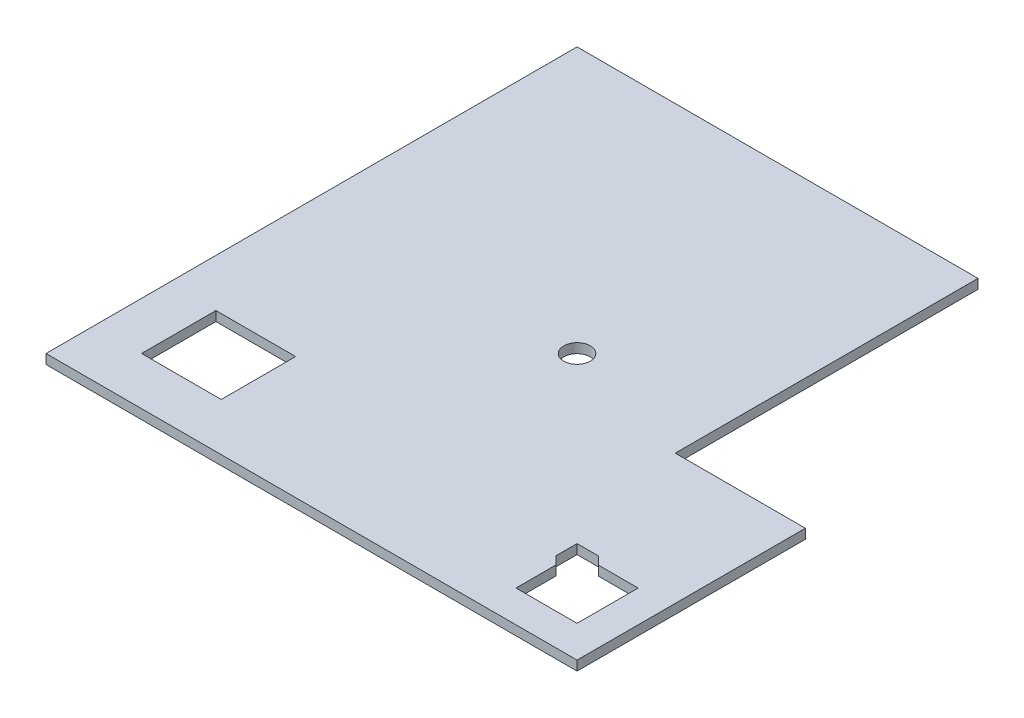
ISO-10303-21;
HEADER;
FILE_DESCRIPTION(('STEP AP214'),'2;1');
FILE_NAME('part.step','',(''),(''),'','','');
FILE_SCHEMA(('AUTOMOTIVE_DESIGN { 1 0 10303 214 1 1 1 1 }'));
ENDSEC;
DATA;
#1=APPLICATION_CONTEXT('core data for automotive mechanical design processes');
#2=APPLICATION_PROTOCOL_DEFINITION('international standard','automotive_design',2000,#1);
#3=PRODUCT_CONTEXT('',#1,'mechanical');
#4=PRODUCT('Part','Part','',(#3));
#5=PRODUCT_RELATED_PRODUCT_CATEGORY('part','',(#4));
#6=PRODUCT_DEFINITION_FORMATION('','',#4);
#7=PRODUCT_DEFINITION_CONTEXT('part definition',#1,'design');
#8=PRODUCT_DEFINITION('design','',#6,#7);
#9=PRODUCT_DEFINITION_SHAPE('','',#8);
#10=(LENGTH_UNIT() NAMED_UNIT(*) SI_UNIT(.MILLI.,.METRE.));
#11=(NAMED_UNIT(*) PLANE_ANGLE_UNIT() SI_UNIT($,.RADIAN.));
#12=(NAMED_UNIT(*) SI_UNIT($,.STERADIAN.) SOLID_ANGLE_UNIT());
#13=UNCERTAINTY_MEASURE_WITH_UNIT(LENGTH_MEASURE(1.E-05),#10,'distance_accuracy_value','');
#14=(GEOMETRIC_REPRESENTATION_CONTEXT(3) GLOBAL_UNCERTAINTY_ASSIGNED_CONTEXT((#13)) GLOBAL_UNIT_ASSIGNED_CONTEXT((#10,
#11,#12)) REPRESENTATION_CONTEXT('',''));
#15=CARTESIAN_POINT('',(0.,0.,0.));
#16=DIRECTION('',(0.,0.,1.));
#17=DIRECTION('',(1.,0.,0.));
#18=AXIS2_PLACEMENT_3D('',#15,#16,#17);
#19=CARTESIAN_POINT('',(0.,18.,-1000.));
#20=DIRECTION('',(1.,0.,0.));
#21=DIRECTION('',(0.,0.,-1.));
#22=AXIS2_PLACEMENT_3D('',#19,#20,#21);
#23=PLANE('',#22);
#24=DIRECTION('',(0.,0.,1.));
#25=VECTOR('',#24,1.);
#26=CARTESIAN_POINT('',(0.,0.,-1000.));
#27=LINE('',#26,#25);
#28=CARTESIAN_POINT('',(0.,0.,-1000.));
#29=VERTEX_POINT('',#28);
#30=CARTESIAN_POINT('',(0.,0.,0.));
#31=VERTEX_POINT('',#30);
#32=EDGE_CURVE('E240',#29,#31,#27,.T.);
#33=ORIENTED_EDGE('',*,*,#32,.T.);
#34=DIRECTION('',(0.,-1.,0.));
#35=VECTOR('',#34,1.);
#36=CARTESIAN_POINT('',(0.,18.,0.));
#37=LINE('',#36,#35);
#38=CARTESIAN_POINT('',(0.,18.,0.));
#39=VERTEX_POINT('',#38);
#40=EDGE_CURVE('E11',#39,#31,#37,.T.);
#41=ORIENTED_EDGE('',*,*,#40,.F.);
#42=DIRECTION('',(0.,0.,1.));
#43=VECTOR('',#42,1.);
#44=CARTESIAN_POINT('',(0.,18.,-1000.));
#45=LINE('',#44,#43);
#46=CARTESIAN_POINT('',(0.,18.,-1000.));
#47=VERTEX_POINT('',#46);
#48=EDGE_CURVE('E241',#47,#39,#45,.T.);
#49=ORIENTED_EDGE('',*,*,#48,.F.);
#50=DIRECTION('',(0.,-1.,0.));
#51=VECTOR('',#50,1.);
#52=CARTESIAN_POINT('',(0.,18.,-1000.));
#53=LINE('',#52,#51);
#54=EDGE_CURVE('E255',#47,#29,#53,.T.);
#55=ORIENTED_EDGE('',*,*,#54,.T.);
#56=EDGE_LOOP('',(#33,#41,#49,#55));
#57=FACE_BOUND('',#56,.T.);
#58=ADVANCED_FACE('F35',(#57),#23,.F.);
#59=CARTESIAN_POINT('',(0.,18.,0.));
#60=DIRECTION('',(0.,0.,-1.));
#61=DIRECTION('',(-1.,0.,0.));
#62=AXIS2_PLACEMENT_3D('',#59,#60,#61);
#63=PLANE('',#62);
#64=DIRECTION('',(1.,0.,0.));
#65=VECTOR('',#64,1.);
#66=CARTESIAN_POINT('',(0.,0.,0.));
#67=LINE('',#66,#65);
#68=CARTESIAN_POINT('',(1000.,0.,-3.85887537858734E-12));
#69=VERTEX_POINT('',#68);
#70=EDGE_CURVE('E258',#31,#69,#67,.T.);
#71=ORIENTED_EDGE('',*,*,#70,.T.);
#72=DIRECTION('',(0.,-1.,0.));
#73=VECTOR('',#72,1.);
#74=CARTESIAN_POINT('',(1000.,18.,-3.85887537858734E-12));
#75=LINE('',#74,#73);
#76=CARTESIAN_POINT('',(1000.,18.,-3.85887537858734E-12));
#77=VERTEX_POINT('',#76);
#78=EDGE_CURVE('E42',#77,#69,#75,.T.);
#79=ORIENTED_EDGE('',*,*,#78,.F.);
#80=DIRECTION('',(1.,0.,0.));
#81=VECTOR('',#80,1.);
#82=CARTESIAN_POINT('',(0.,18.,0.));
#83=LINE('',#82,#81);
#84=EDGE_CURVE('E244',#39,#77,#83,.T.);
#85=ORIENTED_EDGE('',*,*,#84,.F.);
#86=ORIENTED_EDGE('',*,*,#40,.T.);
#87=EDGE_LOOP('',(#71,#79,#85,#86));
#88=FACE_BOUND('',#87,.T.);
#89=ADVANCED_FACE('F304',(#88),#63,.F.);
#90=CARTESIAN_POINT('',(1000.,18.,-3.85887537858734E-12));
#91=DIRECTION('',(-1.,0.,0.));
#92=DIRECTION('',(0.,0.,1.));
#93=AXIS2_PLACEMENT_3D('',#90,#91,#92);
#94=PLANE('',#93);
#95=DIRECTION('',(0.,0.,-1.));
#96=VECTOR('',#95,1.);
#97=CARTESIAN_POINT('',(1000.,0.,-3.85887537858734E-12));
#98=LINE('',#97,#96);
#99=CARTESIAN_POINT('',(1000.,0.,-430.000000000001));
#100=VERTEX_POINT('',#99);
#101=EDGE_CURVE('E260',#69,#100,#98,.T.);
#102=ORIENTED_EDGE('',*,*,#101,.T.);
#103=DIRECTION('',(0.,-1.,0.));
#104=VECTOR('',#103,1.);
#105=CARTESIAN_POINT('',(1000.,18.,-430.000000000001));
#106=LINE('',#105,#104);
#107=CARTESIAN_POINT('',(1000.,18.,-430.000000000001));
#108=VERTEX_POINT('',#107);
#109=EDGE_CURVE('E275',#108,#100,#106,.T.);
#110=ORIENTED_EDGE('',*,*,#109,.F.);
#111=DIRECTION('',(0.,0.,-1.));
#112=VECTOR('',#111,1.);
#113=CARTESIAN_POINT('',(1000.,18.,-3.85887537858734E-12));
#114=LINE('',#113,#112);
#115=EDGE_CURVE('E247',#77,#108,#114,.T.);
#116=ORIENTED_EDGE('',*,*,#115,.F.);
#117=ORIENTED_EDGE('',*,*,#78,.T.);
#118=EDGE_LOOP('',(#102,#110,#116,#117));
#119=FACE_BOUND('',#118,.T.);
#120=ADVANCED_FACE('F282',(#119),#94,.F.);
#121=CARTESIAN_POINT('',(1000.,18.,-430.000000000001));
#122=DIRECTION('',(0.,0.,1.));
#123=DIRECTION('',(1.,0.,0.));
#124=AXIS2_PLACEMENT_3D('',#121,#122,#123);
#125=PLANE('',#124);
#126=DIRECTION('',(-1.,0.,0.));
#127=VECTOR('',#126,1.);
#128=CARTESIAN_POINT('',(1000.,0.,-430.000000000001));
#129=LINE('',#128,#127);
#130=CARTESIAN_POINT('',(755.,0.,-430.));
#131=VERTEX_POINT('',#130);
#132=EDGE_CURVE('E262',#100,#131,#129,.T.);
#133=ORIENTED_EDGE('',*,*,#132,.T.);
#134=DIRECTION('',(0.,-1.,0.));
#135=VECTOR('',#134,1.);
#136=CARTESIAN_POINT('',(755.,18.,-430.));
#137=LINE('',#136,#135);
#138=CARTESIAN_POINT('',(755.,18.,-430.));
#139=VERTEX_POINT('',#138);
#140=EDGE_CURVE('E272',#139,#131,#137,.T.);
#141=ORIENTED_EDGE('',*,*,#140,.F.);
#142=DIRECTION('',(-1.,0.,0.));
#143=VECTOR('',#142,1.);
#144=CARTESIAN_POINT('',(1000.,18.,-430.000000000001));
#145=LINE('',#144,#143);
#146=EDGE_CURVE('E249',#108,#139,#145,.T.);
#147=ORIENTED_EDGE('',*,*,#146,.F.);
#148=ORIENTED_EDGE('',*,*,#109,.T.);
#149=EDGE_LOOP('',(#133,#141,#147,#148));
#150=FACE_BOUND('',#149,.T.);
#151=ADVANCED_FACE('F293',(#150),#125,.F.);
#152=CARTESIAN_POINT('',(755.,18.,-430.));
#153=DIRECTION('',(-1.,0.,0.));
#154=DIRECTION('',(0.,0.,1.));
#155=AXIS2_PLACEMENT_3D('',#152,#153,#154);
#156=PLANE('',#155);
#157=DIRECTION('',(0.,0.,-1.));
#158=VECTOR('',#157,1.);
#159=CARTESIAN_POINT('',(755.,0.,-430.));
#160=LINE('',#159,#158);
#161=CARTESIAN_POINT('',(755.,0.,-1000.));
#162=VERTEX_POINT('',#161);
#163=EDGE_CURVE('E264',#131,#162,#160,.T.);
#164=ORIENTED_EDGE('',*,*,#163,.T.);
#165=DIRECTION('',(0.,-1.,0.));
#166=VECTOR('',#165,1.);
#167=CARTESIAN_POINT('',(755.,18.,-1000.));
#168=LINE('',#167,#166);
#169=CARTESIAN_POINT('',(755.,18.,-1000.));
#170=VERTEX_POINT('',#169);
#171=EDGE_CURVE('E269',#170,#162,#168,.T.);
#172=ORIENTED_EDGE('',*,*,#171,.F.);
#173=DIRECTION('',(0.,0.,-1.));
#174=VECTOR('',#173,1.);
#175=CARTESIAN_POINT('',(755.,18.,-430.));
#176=LINE('',#175,#174);
#177=EDGE_CURVE('E251',#139,#170,#176,.T.);
#178=ORIENTED_EDGE('',*,*,#177,.F.);
#179=ORIENTED_EDGE('',*,*,#140,.T.);
#180=EDGE_LOOP('',(#164,#172,#178,#179));
#181=FACE_BOUND('',#180,.T.);
#182=ADVANCED_FACE('F297',(#181),#156,.F.);
#183=CARTESIAN_POINT('',(755.,18.,-1000.));
#184=DIRECTION('',(0.,0.,1.));
#185=DIRECTION('',(1.,0.,0.));
#186=AXIS2_PLACEMENT_3D('',#183,#184,#185);
#187=PLANE('',#186);
#188=DIRECTION('',(-1.,0.,0.));
#189=VECTOR('',#188,1.);
#190=CARTESIAN_POINT('',(755.,0.,-1000.));
#191=LINE('',#190,#189);
#192=EDGE_CURVE('E245',#162,#29,#191,.T.);
#193=ORIENTED_EDGE('',*,*,#192,.T.);
#194=ORIENTED_EDGE('',*,*,#54,.F.);
#195=DIRECTION('',(-1.,0.,0.));
#196=VECTOR('',#195,1.);
#197=CARTESIAN_POINT('',(755.,18.,-1000.));
#198=LINE('',#197,#196);
#199=EDGE_CURVE('E253',#170,#47,#198,.T.);
#200=ORIENTED_EDGE('',*,*,#199,.F.);
#201=ORIENTED_EDGE('',*,*,#171,.T.);
#202=EDGE_LOOP('',(#193,#194,#200,#201));
#203=FACE_BOUND('',#202,.T.);
#204=ADVANCED_FACE('F307',(#203),#187,.F.);
#205=CARTESIAN_POINT('',(0.,18.,0.));
#206=DIRECTION('',(0.,1.,0.));
#207=DIRECTION('',(0.,0.,1.));
#208=AXIS2_PLACEMENT_3D('',#205,#206,#207);
#209=PLANE('',#208);
#210=CARTESIAN_POINT('',(500.,18.,-500.));
#211=DIRECTION('',(0.,1.,0.));
#212=DIRECTION('',(0.,0.,1.));
#213=AXIS2_PLACEMENT_3D('',#210,#211,#212);
#214=CIRCLE('',#213,25.);
#215=CARTESIAN_POINT('',(500.,18.,-475.));
#216=VERTEX_POINT('',#215);
#217=EDGE_CURVE('E487',#216,#216,#214,.T.);
#218=ORIENTED_EDGE('',*,*,#217,.F.);
#219=EDGE_LOOP('',(#218));
#220=FACE_BOUND('',#219,.T.);
#221=DIRECTION('',(1.,0.,0.));
#222=VECTOR('',#221,1.);
#223=CARTESIAN_POINT('',(940.,18.,-60.));
#224=LINE('',#223,#222);
#225=CARTESIAN_POINT('',(825.,18.,-60.));
#226=VERTEX_POINT('',#225);
#227=CARTESIAN_POINT('',(940.,18.,-60.));
#228=VERTEX_POINT('',#227);
#229=EDGE_CURVE('E49',#226,#228,#224,.T.);
#230=ORIENTED_EDGE('',*,*,#229,.F.);
#231=DIRECTION('',(0.,0.,1.));
#232=VECTOR('',#231,1.);
#233=CARTESIAN_POINT('',(825.,18.,-60.));
#234=LINE('',#233,#232);
#235=CARTESIAN_POINT('',(825.,18.,-134.999999999998));
#236=VERTEX_POINT('',#235);
#237=EDGE_CURVE('E193',#236,#226,#234,.T.);
#238=ORIENTED_EDGE('',*,*,#237,.F.);
#239=DIRECTION('',(0.70710678118657,0.,0.707106781186525));
#240=VECTOR('',#239,1.);
#241=CARTESIAN_POINT('',(825.,18.,-134.999999999998));
#242=LINE('',#241,#240);
#243=CARTESIAN_POINT('',(809.999999999997,18.,-150.));
#244=VERTEX_POINT('',#243);
#245=EDGE_CURVE('E190',#244,#236,#242,.T.);
#246=ORIENTED_EDGE('',*,*,#245,.F.);
#247=DIRECTION('',(0.,0.,1.));
#248=VECTOR('',#247,1.);
#249=CARTESIAN_POINT('',(809.999999999997,18.,-150.));
#250=LINE('',#249,#248);
#251=CARTESIAN_POINT('',(809.999999999998,18.,-189.999999999999));
#252=VERTEX_POINT('',#251);
#253=EDGE_CURVE('E187',#252,#244,#250,.T.);
#254=ORIENTED_EDGE('',*,*,#253,.F.);
#255=DIRECTION('',(-1.,0.,0.));
#256=VECTOR('',#255,1.);
#257=CARTESIAN_POINT('',(849.999999999998,18.,-189.999999999998));
#258=LINE('',#257,#256);
#259=CARTESIAN_POINT('',(849.999999999998,18.,-189.999999999998));
#260=VERTEX_POINT('',#259);
#261=EDGE_CURVE('E181',#260,#252,#258,.T.);
#262=ORIENTED_EDGE('',*,*,#261,.F.);
#263=DIRECTION('',(-0.707106781186646,0.,-0.707106781186449));
#264=VECTOR('',#263,1.);
#265=CARTESIAN_POINT('',(849.999999999998,18.,-189.999999999998));
#266=LINE('',#265,#264);
#267=CARTESIAN_POINT('',(865.,18.,-175.));
#268=VERTEX_POINT('',#267);
#269=EDGE_CURVE('E179',#268,#260,#266,.T.);
#270=ORIENTED_EDGE('',*,*,#269,.F.);
#271=DIRECTION('',(-1.,0.,0.));
#272=VECTOR('',#271,1.);
#273=CARTESIAN_POINT('',(865.,18.,-175.));
#274=LINE('',#273,#272);
#275=CARTESIAN_POINT('',(940.,18.,-175.));
#276=VERTEX_POINT('',#275);
#277=EDGE_CURVE('E162',#276,#268,#274,.T.);
#278=ORIENTED_EDGE('',*,*,#277,.F.);
#279=DIRECTION('',(0.,0.,-1.));
#280=VECTOR('',#279,1.);
#281=CARTESIAN_POINT('',(940.,18.,-60.));
#282=LINE('',#281,#280);
#283=EDGE_CURVE('E171',#228,#276,#282,.T.);
#284=ORIENTED_EDGE('',*,*,#283,.F.);
#285=EDGE_LOOP('',(#230,#238,#246,#254,#262,#270,#278,#284));
#286=FACE_BOUND('',#285,.T.);
#287=DIRECTION('',(0.,0.,-1.));
#288=VECTOR('',#287,1.);
#289=CARTESIAN_POINT('',(239.999999999995,18.,-90.000000000002));
#290=LINE('',#289,#288);
#291=CARTESIAN_POINT('',(239.999999999995,18.,-90.000000000002));
#292=VERTEX_POINT('',#291);
#293=CARTESIAN_POINT('',(239.999999999995,18.,-230.000000000002));
#294=VERTEX_POINT('',#293);
#295=EDGE_CURVE('E210',#292,#294,#290,.T.);
#296=ORIENTED_EDGE('',*,*,#295,.F.);
#297=DIRECTION('',(1.,0.,0.));
#298=VECTOR('',#297,1.);
#299=CARTESIAN_POINT('',(239.999999999995,18.,-90.000000000002));
#300=LINE('',#299,#298);
#301=CARTESIAN_POINT('',(89.9999999999949,18.,-90.000000000002));
#302=VERTEX_POINT('',#301);
#303=EDGE_CURVE('E228',#302,#292,#300,.T.);
#304=ORIENTED_EDGE('',*,*,#303,.F.);
#305=DIRECTION('',(0.,0.,1.));
#306=VECTOR('',#305,1.);
#307=CARTESIAN_POINT('',(89.9999999999949,18.,-90.000000000002));
#308=LINE('',#307,#306);
#309=CARTESIAN_POINT('',(89.9999999999949,18.,-230.000000000002));
#310=VERTEX_POINT('',#309);
#311=EDGE_CURVE('E225',#310,#302,#308,.T.);
#312=ORIENTED_EDGE('',*,*,#311,.F.);
#313=DIRECTION('',(-1.,0.,0.));
#314=VECTOR('',#313,1.);
#315=CARTESIAN_POINT('',(239.999999999995,18.,-230.000000000002));
#316=LINE('',#315,#314);
#317=EDGE_CURVE('E222',#294,#310,#316,.T.);
#318=ORIENTED_EDGE('',*,*,#317,.F.);
#319=EDGE_LOOP('',(#296,#304,#312,#318));
#320=FACE_BOUND('',#319,.T.);
#321=ORIENTED_EDGE('',*,*,#48,.T.);
#322=ORIENTED_EDGE('',*,*,#84,.T.);
#323=ORIENTED_EDGE('',*,*,#115,.T.);
#324=ORIENTED_EDGE('',*,*,#146,.T.);
#325=ORIENTED_EDGE('',*,*,#177,.T.);
#326=ORIENTED_EDGE('',*,*,#199,.T.);
#327=EDGE_LOOP('',(#321,#322,#323,#324,#325,#326));
#328=FACE_BOUND('',#327,.T.);
#329=ADVANCED_FACE('F175',(#220,#286,#320,#328),#209,.T.);
#330=CARTESIAN_POINT('',(0.,0.,0.));
#331=DIRECTION('',(0.,1.,0.));
#332=DIRECTION('',(0.,0.,1.));
#333=AXIS2_PLACEMENT_3D('',#330,#331,#332);
#334=PLANE('',#333);
#335=CARTESIAN_POINT('',(500.,0.,-500.));
#336=DIRECTION('',(0.,1.,0.));
#337=DIRECTION('',(0.,0.,1.));
#338=AXIS2_PLACEMENT_3D('',#335,#336,#337);
#339=CIRCLE('',#338,25.);
#340=CARTESIAN_POINT('',(500.,0.,-475.));
#341=VERTEX_POINT('',#340);
#342=EDGE_CURVE('E484',#341,#341,#339,.T.);
#343=ORIENTED_EDGE('',*,*,#342,.T.);
#344=EDGE_LOOP('',(#343));
#345=FACE_BOUND('',#344,.T.);
#346=DIRECTION('',(0.,0.,-1.));
#347=VECTOR('',#346,1.);
#348=CARTESIAN_POINT('',(825.,0.,-60.));
#349=LINE('',#348,#347);
#350=CARTESIAN_POINT('',(825.,0.,-60.));
#351=VERTEX_POINT('',#350);
#352=CARTESIAN_POINT('',(825.,0.,-134.999999999998));
#353=VERTEX_POINT('',#352);
#354=EDGE_CURVE('E500',#351,#353,#349,.T.);
#355=ORIENTED_EDGE('',*,*,#354,.F.);
#356=DIRECTION('',(-1.,0.,0.));
#357=VECTOR('',#356,1.);
#358=CARTESIAN_POINT('',(940.,0.,-60.));
#359=LINE('',#358,#357);
#360=CARTESIAN_POINT('',(940.,0.,-60.));
#361=VERTEX_POINT('',#360);
#362=EDGE_CURVE('E211',#361,#351,#359,.T.);
#363=ORIENTED_EDGE('',*,*,#362,.F.);
#364=DIRECTION('',(0.,0.,1.));
#365=VECTOR('',#364,1.);
#366=CARTESIAN_POINT('',(940.,0.,-60.));
#367=LINE('',#366,#365);
#368=CARTESIAN_POINT('',(940.,0.,-175.));
#369=VERTEX_POINT('',#368);
#370=EDGE_CURVE('E208',#369,#361,#367,.T.);
#371=ORIENTED_EDGE('',*,*,#370,.F.);
#372=DIRECTION('',(1.,0.,0.));
#373=VECTOR('',#372,1.);
#374=CARTESIAN_POINT('',(865.,0.,-175.));
#375=LINE('',#374,#373);
#376=CARTESIAN_POINT('',(865.,0.,-175.));
#377=VERTEX_POINT('',#376);
#378=EDGE_CURVE('E165',#377,#369,#375,.T.);
#379=ORIENTED_EDGE('',*,*,#378,.F.);
#380=DIRECTION('',(0.707106781186646,0.,0.707106781186449));
#381=VECTOR('',#380,1.);
#382=CARTESIAN_POINT('',(849.999999999998,0.,-189.999999999998));
#383=LINE('',#382,#381);
#384=CARTESIAN_POINT('',(849.999999999998,0.,-189.999999999998));
#385=VERTEX_POINT('',#384);
#386=EDGE_CURVE('E492',#385,#377,#383,.T.);
#387=ORIENTED_EDGE('',*,*,#386,.F.);
#388=DIRECTION('',(1.,0.,0.));
#389=VECTOR('',#388,1.);
#390=CARTESIAN_POINT('',(849.999999999998,0.,-189.999999999998));
#391=LINE('',#390,#389);
#392=CARTESIAN_POINT('',(809.999999999998,0.,-189.999999999999));
#393=VERTEX_POINT('',#392);
#394=EDGE_CURVE('E494',#393,#385,#391,.T.);
#395=ORIENTED_EDGE('',*,*,#394,.F.);
#396=DIRECTION('',(0.,0.,-1.));
#397=VECTOR('',#396,1.);
#398=CARTESIAN_POINT('',(809.999999999997,0.,-150.));
#399=LINE('',#398,#397);
#400=CARTESIAN_POINT('',(809.999999999997,0.,-150.));
#401=VERTEX_POINT('',#400);
#402=EDGE_CURVE('E496',#401,#393,#399,.T.);
#403=ORIENTED_EDGE('',*,*,#402,.F.);
#404=DIRECTION('',(-0.707106781186571,0.,-0.707106781186525));
#405=VECTOR('',#404,1.);
#406=CARTESIAN_POINT('',(825.,0.,-134.999999999998));
#407=LINE('',#406,#405);
#408=EDGE_CURVE('E498',#353,#401,#407,.T.);
#409=ORIENTED_EDGE('',*,*,#408,.F.);
#410=EDGE_LOOP('',(#355,#363,#371,#379,#387,#395,#403,#409));
#411=FACE_BOUND('',#410,.T.);
#412=DIRECTION('',(-1.,0.,0.));
#413=VECTOR('',#412,1.);
#414=CARTESIAN_POINT('',(239.999999999995,0.,-90.000000000002));
#415=LINE('',#414,#413);
#416=CARTESIAN_POINT('',(239.999999999995,0.,-90.000000000002));
#417=VERTEX_POINT('',#416);
#418=CARTESIAN_POINT('',(89.9999999999949,0.,-90.000000000002));
#419=VERTEX_POINT('',#418);
#420=EDGE_CURVE('E215',#417,#419,#415,.T.);
#421=ORIENTED_EDGE('',*,*,#420,.F.);
#422=DIRECTION('',(0.,0.,1.));
#423=VECTOR('',#422,1.);
#424=CARTESIAN_POINT('',(239.999999999995,0.,-90.000000000002));
#425=LINE('',#424,#423);
#426=CARTESIAN_POINT('',(239.999999999995,0.,-230.000000000002));
#427=VERTEX_POINT('',#426);
#428=EDGE_CURVE('E218',#427,#417,#425,.T.);
#429=ORIENTED_EDGE('',*,*,#428,.F.);
#430=DIRECTION('',(1.,0.,0.));
#431=VECTOR('',#430,1.);
#432=CARTESIAN_POINT('',(239.999999999995,0.,-230.000000000002));
#433=LINE('',#432,#431);
#434=CARTESIAN_POINT('',(89.9999999999949,0.,-230.000000000002));
#435=VERTEX_POINT('',#434);
#436=EDGE_CURVE('E220',#435,#427,#433,.T.);
#437=ORIENTED_EDGE('',*,*,#436,.F.);
#438=DIRECTION('',(0.,0.,-1.));
#439=VECTOR('',#438,1.);
#440=CARTESIAN_POINT('',(89.9999999999949,0.,-90.000000000002));
#441=LINE('',#440,#439);
#442=EDGE_CURVE('E212',#419,#435,#441,.T.);
#443=ORIENTED_EDGE('',*,*,#442,.F.);
#444=EDGE_LOOP('',(#421,#429,#437,#443));
#445=FACE_BOUND('',#444,.T.);
#446=ORIENTED_EDGE('',*,*,#32,.F.);
#447=ORIENTED_EDGE('',*,*,#192,.F.);
#448=ORIENTED_EDGE('',*,*,#163,.F.);
#449=ORIENTED_EDGE('',*,*,#132,.F.);
#450=ORIENTED_EDGE('',*,*,#101,.F.);
#451=ORIENTED_EDGE('',*,*,#70,.F.);
#452=EDGE_LOOP('',(#446,#447,#448,#449,#450,#451));
#453=FACE_BOUND('',#452,.T.);
#454=ADVANCED_FACE('F288',(#345,#411,#445,#453),#334,.F.);
#455=CARTESIAN_POINT('',(239.999999999995,-205.182845286832,-90.000000000002));
#456=DIRECTION('',(1.,0.,0.));
#457=DIRECTION('',(0.,0.,-1.));
#458=AXIS2_PLACEMENT_3D('',#455,#456,#457);
#459=PLANE('',#458);
#460=ORIENTED_EDGE('',*,*,#428,.T.);
#461=DIRECTION('',(0.,1.,0.));
#462=VECTOR('',#461,1.);
#463=CARTESIAN_POINT('',(239.999999999995,-205.182845286832,-90.000000000002));
#464=LINE('',#463,#462);
#465=EDGE_CURVE('E216',#417,#292,#464,.T.);
#466=ORIENTED_EDGE('',*,*,#465,.T.);
#467=ORIENTED_EDGE('',*,*,#295,.T.);
#468=DIRECTION('',(0.,1.,0.));
#469=VECTOR('',#468,1.);
#470=CARTESIAN_POINT('',(239.999999999995,-205.182845286832,-230.000000000002));
#471=LINE('',#470,#469);
#472=EDGE_CURVE('E231',#427,#294,#471,.T.);
#473=ORIENTED_EDGE('',*,*,#472,.F.);
#474=EDGE_LOOP('',(#460,#466,#467,#473));
#475=FACE_BOUND('',#474,.T.);
#476=ADVANCED_FACE('F347',(#475),#459,.F.);
#477=CARTESIAN_POINT('',(239.999999999995,-205.182845286832,-90.000000000002));
#478=DIRECTION('',(0.,0.,1.));
#479=DIRECTION('',(1.,0.,0.));
#480=AXIS2_PLACEMENT_3D('',#477,#478,#479);
#481=PLANE('',#480);
#482=ORIENTED_EDGE('',*,*,#420,.T.);
#483=DIRECTION('',(0.,1.,0.));
#484=VECTOR('',#483,1.);
#485=CARTESIAN_POINT('',(89.9999999999949,-205.182845286832,-90.000000000002));
#486=LINE('',#485,#484);
#487=EDGE_CURVE('E233',#419,#302,#486,.T.);
#488=ORIENTED_EDGE('',*,*,#487,.T.);
#489=ORIENTED_EDGE('',*,*,#303,.T.);
#490=ORIENTED_EDGE('',*,*,#465,.F.);
#491=EDGE_LOOP('',(#482,#488,#489,#490));
#492=FACE_BOUND('',#491,.T.);
#493=ADVANCED_FACE('F352',(#492),#481,.F.);
#494=CARTESIAN_POINT('',(89.9999999999949,-205.182845286832,-90.000000000002));
#495=DIRECTION('',(-1.,0.,0.));
#496=DIRECTION('',(0.,0.,1.));
#497=AXIS2_PLACEMENT_3D('',#494,#495,#496);
#498=PLANE('',#497);
#499=ORIENTED_EDGE('',*,*,#442,.T.);
#500=DIRECTION('',(0.,1.,0.));
#501=VECTOR('',#500,1.);
#502=CARTESIAN_POINT('',(89.9999999999949,-205.182845286832,-230.000000000002));
#503=LINE('',#502,#501);
#504=EDGE_CURVE('E235',#435,#310,#503,.T.);
#505=ORIENTED_EDGE('',*,*,#504,.T.);
#506=ORIENTED_EDGE('',*,*,#311,.T.);
#507=ORIENTED_EDGE('',*,*,#487,.F.);
#508=EDGE_LOOP('',(#499,#505,#506,#507));
#509=FACE_BOUND('',#508,.T.);
#510=ADVANCED_FACE('F364',(#509),#498,.F.);
#511=CARTESIAN_POINT('',(239.999999999995,-205.182845286832,-230.000000000002));
#512=DIRECTION('',(0.,0.,-1.));
#513=DIRECTION('',(-1.,0.,0.));
#514=AXIS2_PLACEMENT_3D('',#511,#512,#513);
#515=PLANE('',#514);
#516=ORIENTED_EDGE('',*,*,#436,.T.);
#517=ORIENTED_EDGE('',*,*,#472,.T.);
#518=ORIENTED_EDGE('',*,*,#317,.T.);
#519=ORIENTED_EDGE('',*,*,#504,.F.);
#520=EDGE_LOOP('',(#516,#517,#518,#519));
#521=FACE_BOUND('',#520,.T.);
#522=ADVANCED_FACE('F374',(#521),#515,.F.);
#523=CARTESIAN_POINT('',(940.,-183.847763108504,-60.));
#524=DIRECTION('',(0.,0.,1.));
#525=DIRECTION('',(1.,0.,0.));
#526=AXIS2_PLACEMENT_3D('',#523,#524,#525);
#527=PLANE('',#526);
#528=ORIENTED_EDGE('',*,*,#362,.T.);
#529=DIRECTION('',(0.,1.,0.));
#530=VECTOR('',#529,1.);
#531=CARTESIAN_POINT('',(825.,-183.847763108504,-60.));
#532=LINE('',#531,#530);
#533=EDGE_CURVE('E196',#351,#226,#532,.T.);
#534=ORIENTED_EDGE('',*,*,#533,.T.);
#535=ORIENTED_EDGE('',*,*,#229,.T.);
#536=DIRECTION('',(0.,1.,0.));
#537=VECTOR('',#536,1.);
#538=CARTESIAN_POINT('',(940.,-183.847763108504,-60.));
#539=LINE('',#538,#537);
#540=EDGE_CURVE('E168',#361,#228,#539,.T.);
#541=ORIENTED_EDGE('',*,*,#540,.F.);
#542=EDGE_LOOP('',(#528,#534,#535,#541));
#543=FACE_BOUND('',#542,.T.);
#544=ADVANCED_FACE('F384',(#543),#527,.F.);
#545=CARTESIAN_POINT('',(825.,-183.847763108504,-60.));
#546=DIRECTION('',(-1.,0.,0.));
#547=DIRECTION('',(0.,0.,1.));
#548=AXIS2_PLACEMENT_3D('',#545,#546,#547);
#549=PLANE('',#548);
#550=ORIENTED_EDGE('',*,*,#354,.T.);
#551=DIRECTION('',(0.,1.,0.));
#552=VECTOR('',#551,1.);
#553=CARTESIAN_POINT('',(825.,-183.847763108504,-134.999999999998));
#554=LINE('',#553,#552);
#555=EDGE_CURVE('E198',#353,#236,#554,.T.);
#556=ORIENTED_EDGE('',*,*,#555,.T.);
#557=ORIENTED_EDGE('',*,*,#237,.T.);
#558=ORIENTED_EDGE('',*,*,#533,.F.);
#559=EDGE_LOOP('',(#550,#556,#557,#558));
#560=FACE_BOUND('',#559,.T.);
#561=ADVANCED_FACE('F394',(#560),#549,.F.);
#562=CARTESIAN_POINT('',(825.,-183.847763108504,-134.999999999998));
#563=DIRECTION('',(-0.707106781186525,0.,0.707106781186571));
#564=DIRECTION('',(0.707106781186571,0.,0.707106781186525));
#565=AXIS2_PLACEMENT_3D('',#562,#563,#564);
#566=PLANE('',#565);
#567=ORIENTED_EDGE('',*,*,#408,.T.);
#568=DIRECTION('',(0.,1.,0.));
#569=VECTOR('',#568,1.);
#570=CARTESIAN_POINT('',(809.999999999997,-183.847763108504,-150.));
#571=LINE('',#570,#569);
#572=EDGE_CURVE('E200',#401,#244,#571,.T.);
#573=ORIENTED_EDGE('',*,*,#572,.T.);
#574=ORIENTED_EDGE('',*,*,#245,.T.);
#575=ORIENTED_EDGE('',*,*,#555,.F.);
#576=EDGE_LOOP('',(#567,#573,#574,#575));
#577=FACE_BOUND('',#576,.T.);
#578=ADVANCED_FACE('F403',(#577),#566,.F.);
#579=CARTESIAN_POINT('',(809.999999999997,-183.847763108504,-150.));
#580=DIRECTION('',(-1.,0.,0.));
#581=DIRECTION('',(0.,0.,1.));
#582=AXIS2_PLACEMENT_3D('',#579,#580,#581);
#583=PLANE('',#582);
#584=ORIENTED_EDGE('',*,*,#402,.T.);
#585=DIRECTION('',(0.,1.,0.));
#586=VECTOR('',#585,1.);
#587=CARTESIAN_POINT('',(809.999999999998,-183.847763108504,-189.999999999999));
#588=LINE('',#587,#586);
#589=EDGE_CURVE('E202',#393,#252,#588,.T.);
#590=ORIENTED_EDGE('',*,*,#589,.T.);
#591=ORIENTED_EDGE('',*,*,#253,.T.);
#592=ORIENTED_EDGE('',*,*,#572,.F.);
#593=EDGE_LOOP('',(#584,#590,#591,#592));
#594=FACE_BOUND('',#593,.T.);
#595=ADVANCED_FACE('F413',(#594),#583,.F.);
#596=CARTESIAN_POINT('',(849.999999999998,-183.847763108504,-189.999999999998));
#597=DIRECTION('',(0.,0.,-1.));
#598=DIRECTION('',(-1.,0.,0.));
#599=AXIS2_PLACEMENT_3D('',#596,#597,#598);
#600=PLANE('',#599);
#601=ORIENTED_EDGE('',*,*,#394,.T.);
#602=DIRECTION('',(0.,1.,0.));
#603=VECTOR('',#602,1.);
#604=CARTESIAN_POINT('',(849.999999999998,-183.847763108504,-189.999999999998));
#605=LINE('',#604,#603);
#606=EDGE_CURVE('E204',#385,#260,#605,.T.);
#607=ORIENTED_EDGE('',*,*,#606,.T.);
#608=ORIENTED_EDGE('',*,*,#261,.T.);
#609=ORIENTED_EDGE('',*,*,#589,.F.);
#610=EDGE_LOOP('',(#601,#607,#608,#609));
#611=FACE_BOUND('',#610,.T.);
#612=ADVANCED_FACE('F423',(#611),#600,.F.);
#613=CARTESIAN_POINT('',(849.999999999998,-183.847763108504,-189.999999999998));
#614=DIRECTION('',(0.707106781186449,0.,-0.707106781186646));
#615=DIRECTION('',(-0.707106781186646,0.,-0.707106781186449));
#616=AXIS2_PLACEMENT_3D('',#613,#614,#615);
#617=PLANE('',#616);
#618=ORIENTED_EDGE('',*,*,#386,.T.);
#619=DIRECTION('',(0.,1.,0.));
#620=VECTOR('',#619,1.);
#621=CARTESIAN_POINT('',(865.,-183.847763108504,-175.));
#622=LINE('',#621,#620);
#623=EDGE_CURVE('E167',#377,#268,#622,.T.);
#624=ORIENTED_EDGE('',*,*,#623,.T.);
#625=ORIENTED_EDGE('',*,*,#269,.T.);
#626=ORIENTED_EDGE('',*,*,#606,.F.);
#627=EDGE_LOOP('',(#618,#624,#625,#626));
#628=FACE_BOUND('',#627,.T.);
#629=ADVANCED_FACE('F433',(#628),#617,.F.);
#630=CARTESIAN_POINT('',(865.,-183.847763108504,-175.));
#631=DIRECTION('',(0.,0.,-1.));
#632=DIRECTION('',(-1.,0.,0.));
#633=AXIS2_PLACEMENT_3D('',#630,#631,#632);
#634=PLANE('',#633);
#635=ORIENTED_EDGE('',*,*,#378,.T.);
#636=DIRECTION('',(0.,1.,0.));
#637=VECTOR('',#636,1.);
#638=CARTESIAN_POINT('',(940.,-183.847763108504,-175.));
#639=LINE('',#638,#637);
#640=EDGE_CURVE('E57',#369,#276,#639,.T.);
#641=ORIENTED_EDGE('',*,*,#640,.T.);
#642=ORIENTED_EDGE('',*,*,#277,.T.);
#643=ORIENTED_EDGE('',*,*,#623,.F.);
#644=EDGE_LOOP('',(#635,#641,#642,#643));
#645=FACE_BOUND('',#644,.T.);
#646=ADVANCED_FACE('F159',(#645),#634,.F.);
#647=CARTESIAN_POINT('',(940.,-183.847763108504,-60.));
#648=DIRECTION('',(1.,0.,0.));
#649=DIRECTION('',(0.,0.,-1.));
#650=AXIS2_PLACEMENT_3D('',#647,#648,#649);
#651=PLANE('',#650);
#652=ORIENTED_EDGE('',*,*,#370,.T.);
#653=ORIENTED_EDGE('',*,*,#540,.T.);
#654=ORIENTED_EDGE('',*,*,#283,.T.);
#655=ORIENTED_EDGE('',*,*,#640,.F.);
#656=EDGE_LOOP('',(#652,#653,#654,#655));
#657=FACE_BOUND('',#656,.T.);
#658=ADVANCED_FACE('F172',(#657),#651,.F.);
#659=CARTESIAN_POINT('',(500.,0.,-500.));
#660=DIRECTION('',(0.,1.,0.));
#661=DIRECTION('',(0.,0.,1.));
#662=AXIS2_PLACEMENT_3D('',#659,#660,#661);
#663=CYLINDRICAL_SURFACE('',#662,25.);
#664=ORIENTED_EDGE('',*,*,#342,.F.);
#665=EDGE_LOOP('',(#664));
#666=FACE_BOUND('',#665,.T.);
#667=ORIENTED_EDGE('',*,*,#217,.T.);
#668=EDGE_LOOP('',(#667));
#669=FACE_BOUND('',#668,.T.);
#670=ADVANCED_FACE('F460',(#666,#669),#663,.F.);
#671=CLOSED_SHELL('',(#58,#89,#120,#151,#182,#204,#329,#454,#476,#493,#510,#522,#544,#561,#578,
#595,#612,#629,#646,#658,#670));
#672=MANIFOLD_SOLID_BREP('B2',#671);
#673=ADVANCED_BREP_SHAPE_REPRESENTATION('',(#18,#672),#14);
#674=SHAPE_DEFINITION_REPRESENTATION(#9,#673);
ENDSEC;
END-ISO-10303-21;
